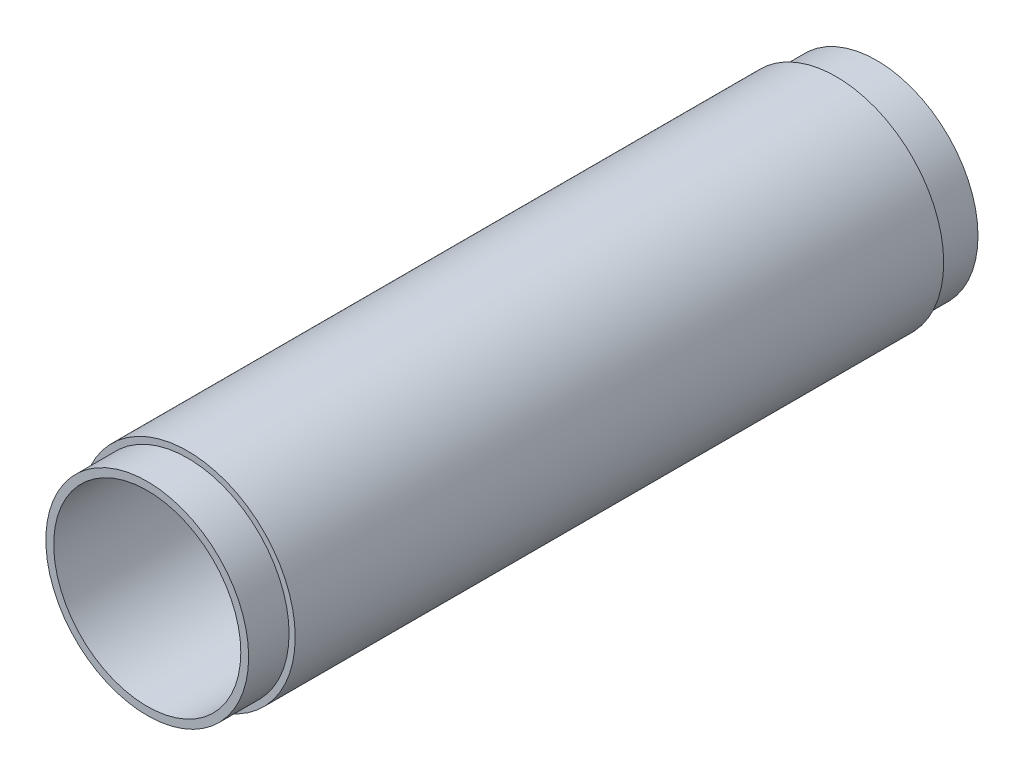
ISO-10303-21;
HEADER;
FILE_DESCRIPTION(('STEP AP214'),'2;1');
FILE_NAME('part.step','',(''),(''),'','','');
FILE_SCHEMA(('AUTOMOTIVE_DESIGN { 1 0 10303 214 1 1 1 1 }'));
ENDSEC;
DATA;
#1=APPLICATION_CONTEXT('core data for automotive mechanical design processes');
#2=APPLICATION_PROTOCOL_DEFINITION('international standard','automotive_design',2000,#1);
#3=PRODUCT_CONTEXT('',#1,'mechanical');
#4=PRODUCT('Part','Part','',(#3));
#5=PRODUCT_RELATED_PRODUCT_CATEGORY('part','',(#4));
#6=PRODUCT_DEFINITION_FORMATION('','',#4);
#7=PRODUCT_DEFINITION_CONTEXT('part definition',#1,'design');
#8=PRODUCT_DEFINITION('design','',#6,#7);
#9=PRODUCT_DEFINITION_SHAPE('','',#8);
#10=(LENGTH_UNIT() NAMED_UNIT(*) SI_UNIT(.MILLI.,.METRE.));
#11=(NAMED_UNIT(*) PLANE_ANGLE_UNIT() SI_UNIT($,.RADIAN.));
#12=(NAMED_UNIT(*) SI_UNIT($,.STERADIAN.) SOLID_ANGLE_UNIT());
#13=UNCERTAINTY_MEASURE_WITH_UNIT(LENGTH_MEASURE(1.E-05),#10,'distance_accuracy_value','');
#14=(GEOMETRIC_REPRESENTATION_CONTEXT(3) GLOBAL_UNCERTAINTY_ASSIGNED_CONTEXT((#13)) GLOBAL_UNIT_ASSIGNED_CONTEXT((#10,
#11,#12)) REPRESENTATION_CONTEXT('',''));
#15=CARTESIAN_POINT('',(0.,0.,0.));
#16=DIRECTION('',(0.,0.,1.));
#17=DIRECTION('',(1.,0.,0.));
#18=AXIS2_PLACEMENT_3D('',#15,#16,#17);
#19=CARTESIAN_POINT('',(0.,11.9761,0.));
#20=DIRECTION('',(0.,0.,-1.));
#21=DIRECTION('',(-1.,0.,0.));
#22=AXIS2_PLACEMENT_3D('',#19,#20,#21);
#23=PLANE('',#22);
#24=CARTESIAN_POINT('',(0.,0.,0.));
#25=DIRECTION('',(0.,0.,1.));
#26=DIRECTION('',(1.,0.,0.));
#27=AXIS2_PLACEMENT_3D('',#24,#25,#26);
#28=CIRCLE('',#27,11.049);
#29=CARTESIAN_POINT('',(11.049,0.,0.));
#30=VERTEX_POINT('',#29);
#31=EDGE_CURVE('E10',#30,#30,#28,.T.);
#32=ORIENTED_EDGE('',*,*,#31,.F.);
#33=EDGE_LOOP('',(#32));
#34=FACE_BOUND('',#33,.T.);
#35=CARTESIAN_POINT('',(0.,0.,0.));
#36=DIRECTION('',(0.,0.,1.));
#37=DIRECTION('',(1.,0.,0.));
#38=AXIS2_PLACEMENT_3D('',#35,#36,#37);
#39=CIRCLE('',#38,11.9761);
#40=CARTESIAN_POINT('',(11.9761,0.,0.));
#41=VERTEX_POINT('',#40);
#42=EDGE_CURVE('E58',#41,#41,#39,.T.);
#43=ORIENTED_EDGE('',*,*,#42,.T.);
#44=EDGE_LOOP('',(#43));
#45=FACE_BOUND('',#44,.T.);
#46=ADVANCED_FACE('F30',(#34,#45),#23,.F.);
#47=CARTESIAN_POINT('',(0.,0.,-14.1067387719344));
#48=DIRECTION('',(0.,0.,1.));
#49=DIRECTION('',(1.,0.,0.));
#50=AXIS2_PLACEMENT_3D('',#47,#48,#49);
#51=CYLINDRICAL_SURFACE('',#50,11.049);
#52=CARTESIAN_POINT('',(0.,0.,-86.1441));
#53=DIRECTION('',(0.,0.,1.));
#54=DIRECTION('',(1.,0.,0.));
#55=AXIS2_PLACEMENT_3D('',#52,#53,#54);
#56=CIRCLE('',#55,11.049);
#57=CARTESIAN_POINT('',(11.049,0.,-86.1441));
#58=VERTEX_POINT('',#57);
#59=EDGE_CURVE('E36',#58,#58,#56,.T.);
#60=ORIENTED_EDGE('',*,*,#59,.F.);
#61=EDGE_LOOP('',(#60));
#62=FACE_BOUND('',#61,.T.);
#63=ORIENTED_EDGE('',*,*,#31,.T.);
#64=EDGE_LOOP('',(#63));
#65=FACE_BOUND('',#64,.T.);
#66=ADVANCED_FACE('F95',(#62,#65),#51,.F.);
#67=CARTESIAN_POINT('',(0.,11.049,-86.1441));
#68=DIRECTION('',(0.,0.,1.));
#69=DIRECTION('',(1.,0.,0.));
#70=AXIS2_PLACEMENT_3D('',#67,#68,#69);
#71=PLANE('',#70);
#72=CARTESIAN_POINT('',(0.,0.,-86.1441));
#73=DIRECTION('',(0.,0.,1.));
#74=DIRECTION('',(1.,0.,0.));
#75=AXIS2_PLACEMENT_3D('',#72,#73,#74);
#76=CIRCLE('',#75,11.9761);
#77=CARTESIAN_POINT('',(11.9761,0.,-86.1441));
#78=VERTEX_POINT('',#77);
#79=EDGE_CURVE('E40',#78,#78,#76,.T.);
#80=ORIENTED_EDGE('',*,*,#79,.F.);
#81=EDGE_LOOP('',(#80));
#82=FACE_BOUND('',#81,.T.);
#83=ORIENTED_EDGE('',*,*,#59,.T.);
#84=EDGE_LOOP('',(#83));
#85=FACE_BOUND('',#84,.T.);
#86=ADVANCED_FACE('F90',(#82,#85),#71,.F.);
#87=CARTESIAN_POINT('',(0.,0.,-14.1067387719344));
#88=DIRECTION('',(0.,0.,1.));
#89=DIRECTION('',(1.,0.,0.));
#90=AXIS2_PLACEMENT_3D('',#87,#88,#89);
#91=CYLINDRICAL_SURFACE('',#90,11.9761);
#92=CARTESIAN_POINT('',(0.,0.,-81.3689));
#93=DIRECTION('',(0.,0.,1.));
#94=DIRECTION('',(1.,0.,0.));
#95=AXIS2_PLACEMENT_3D('',#92,#93,#94);
#96=CIRCLE('',#95,11.9761);
#97=CARTESIAN_POINT('',(11.9761,0.,-81.3689));
#98=VERTEX_POINT('',#97);
#99=EDGE_CURVE('E44',#98,#98,#96,.T.);
#100=ORIENTED_EDGE('',*,*,#99,.F.);
#101=EDGE_LOOP('',(#100));
#102=FACE_BOUND('',#101,.T.);
#103=ORIENTED_EDGE('',*,*,#79,.T.);
#104=EDGE_LOOP('',(#103));
#105=FACE_BOUND('',#104,.T.);
#106=ADVANCED_FACE('F84',(#102,#105),#91,.T.);
#107=CARTESIAN_POINT('',(0.,11.9761,-81.3689));
#108=DIRECTION('',(0.,0.,1.));
#109=DIRECTION('',(1.,0.,0.));
#110=AXIS2_PLACEMENT_3D('',#107,#108,#109);
#111=PLANE('',#110);
#112=CARTESIAN_POINT('',(0.,0.,-81.3689));
#113=DIRECTION('',(0.,0.,1.));
#114=DIRECTION('',(1.,0.,0.));
#115=AXIS2_PLACEMENT_3D('',#112,#113,#114);
#116=CIRCLE('',#115,12.7);
#117=CARTESIAN_POINT('',(12.7,0.,-81.3689));
#118=VERTEX_POINT('',#117);
#119=EDGE_CURVE('E49',#118,#118,#116,.T.);
#120=ORIENTED_EDGE('',*,*,#119,.F.);
#121=EDGE_LOOP('',(#120));
#122=FACE_BOUND('',#121,.T.);
#123=ORIENTED_EDGE('',*,*,#99,.T.);
#124=EDGE_LOOP('',(#123));
#125=FACE_BOUND('',#124,.T.);
#126=ADVANCED_FACE('F78',(#122,#125),#111,.F.);
#127=CARTESIAN_POINT('',(0.,0.,-14.1067387719344));
#128=DIRECTION('',(0.,0.,1.));
#129=DIRECTION('',(1.,0.,0.));
#130=AXIS2_PLACEMENT_3D('',#127,#128,#129);
#131=CYLINDRICAL_SURFACE('',#130,12.7);
#132=CARTESIAN_POINT('',(0.,0.,-4.7752));
#133=DIRECTION('',(0.,0.,1.));
#134=DIRECTION('',(1.,0.,0.));
#135=AXIS2_PLACEMENT_3D('',#132,#133,#134);
#136=CIRCLE('',#135,12.7);
#137=CARTESIAN_POINT('',(12.7,0.,-4.7752));
#138=VERTEX_POINT('',#137);
#139=EDGE_CURVE('E52',#138,#138,#136,.T.);
#140=ORIENTED_EDGE('',*,*,#139,.F.);
#141=EDGE_LOOP('',(#140));
#142=FACE_BOUND('',#141,.T.);
#143=ORIENTED_EDGE('',*,*,#119,.T.);
#144=EDGE_LOOP('',(#143));
#145=FACE_BOUND('',#144,.T.);
#146=ADVANCED_FACE('F72',(#142,#145),#131,.T.);
#147=CARTESIAN_POINT('',(0.,12.7,-4.7752));
#148=DIRECTION('',(0.,0.,-1.));
#149=DIRECTION('',(-1.,0.,0.));
#150=AXIS2_PLACEMENT_3D('',#147,#148,#149);
#151=PLANE('',#150);
#152=CARTESIAN_POINT('',(0.,0.,-4.7752));
#153=DIRECTION('',(0.,0.,1.));
#154=DIRECTION('',(1.,0.,0.));
#155=AXIS2_PLACEMENT_3D('',#152,#153,#154);
#156=CIRCLE('',#155,11.9761);
#157=CARTESIAN_POINT('',(11.9761,0.,-4.7752));
#158=VERTEX_POINT('',#157);
#159=EDGE_CURVE('E55',#158,#158,#156,.T.);
#160=ORIENTED_EDGE('',*,*,#159,.F.);
#161=EDGE_LOOP('',(#160));
#162=FACE_BOUND('',#161,.T.);
#163=ORIENTED_EDGE('',*,*,#139,.T.);
#164=EDGE_LOOP('',(#163));
#165=FACE_BOUND('',#164,.T.);
#166=ADVANCED_FACE('F66',(#162,#165),#151,.F.);
#167=CARTESIAN_POINT('',(0.,0.,-14.1067387719344));
#168=DIRECTION('',(0.,0.,1.));
#169=DIRECTION('',(1.,0.,0.));
#170=AXIS2_PLACEMENT_3D('',#167,#168,#169);
#171=CYLINDRICAL_SURFACE('',#170,11.9761);
#172=ORIENTED_EDGE('',*,*,#42,.F.);
#173=EDGE_LOOP('',(#172));
#174=FACE_BOUND('',#173,.T.);
#175=ORIENTED_EDGE('',*,*,#159,.T.);
#176=EDGE_LOOP('',(#175));
#177=FACE_BOUND('',#176,.T.);
#178=ADVANCED_FACE('F63',(#174,#177),#171,.T.);
#179=CLOSED_SHELL('',(#46,#66,#86,#106,#126,#146,#166,#178));
#180=MANIFOLD_SOLID_BREP('B2',#179);
#181=ADVANCED_BREP_SHAPE_REPRESENTATION('',(#18,#180),#14);
#182=SHAPE_DEFINITION_REPRESENTATION(#9,#181);
ENDSEC;
END-ISO-10303-21;
